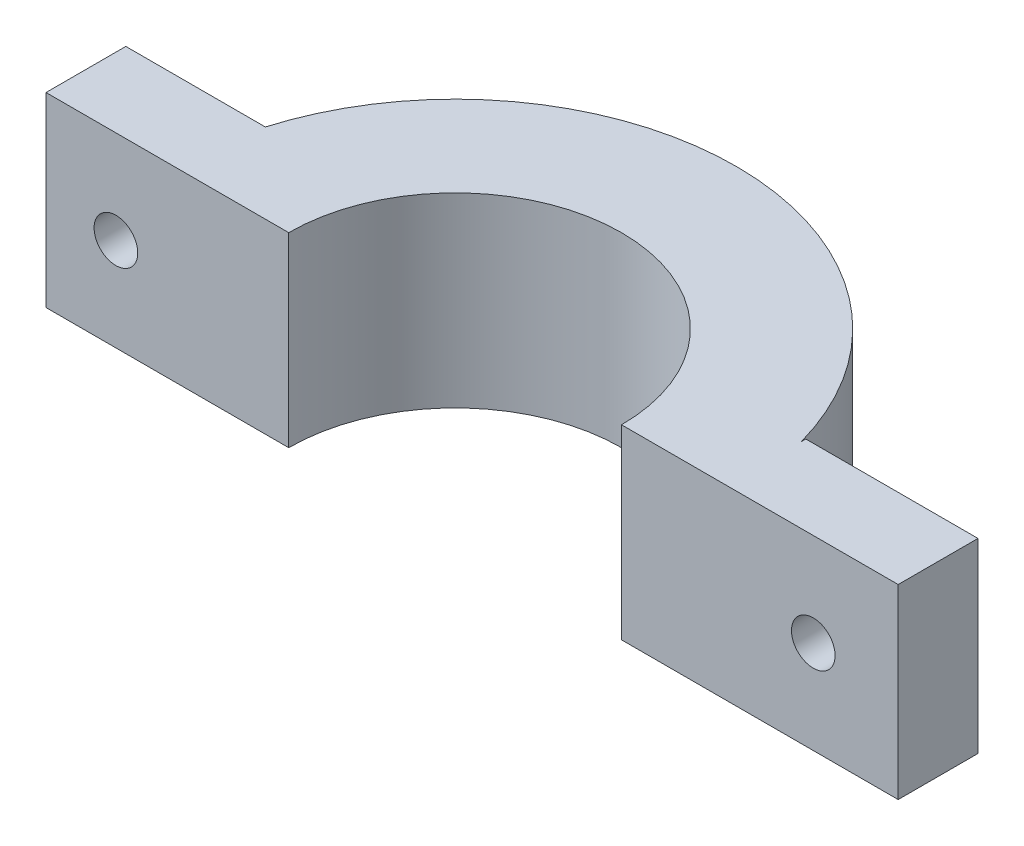
ISO-10303-21;
HEADER;
FILE_DESCRIPTION(('STEP AP214'),'2;1');
FILE_NAME('part.step','',(''),(''),'','','');
FILE_SCHEMA(('AUTOMOTIVE_DESIGN { 1 0 10303 214 1 1 1 1 }'));
ENDSEC;
DATA;
#1=APPLICATION_CONTEXT('core data for automotive mechanical design processes');
#2=APPLICATION_PROTOCOL_DEFINITION('international standard','automotive_design',2000,#1);
#3=PRODUCT_CONTEXT('',#1,'mechanical');
#4=PRODUCT('Part','Part','',(#3));
#5=PRODUCT_RELATED_PRODUCT_CATEGORY('part','',(#4));
#6=PRODUCT_DEFINITION_FORMATION('','',#4);
#7=PRODUCT_DEFINITION_CONTEXT('part definition',#1,'design');
#8=PRODUCT_DEFINITION('design','',#6,#7);
#9=PRODUCT_DEFINITION_SHAPE('','',#8);
#10=(LENGTH_UNIT() NAMED_UNIT(*) SI_UNIT(.MILLI.,.METRE.));
#11=(NAMED_UNIT(*) PLANE_ANGLE_UNIT() SI_UNIT($,.RADIAN.));
#12=(NAMED_UNIT(*) SI_UNIT($,.STERADIAN.) SOLID_ANGLE_UNIT());
#13=UNCERTAINTY_MEASURE_WITH_UNIT(LENGTH_MEASURE(1.E-05),#10,'distance_accuracy_value','');
#14=(GEOMETRIC_REPRESENTATION_CONTEXT(3) GLOBAL_UNCERTAINTY_ASSIGNED_CONTEXT((#13)) GLOBAL_UNIT_ASSIGNED_CONTEXT((#10,
#11,#12)) REPRESENTATION_CONTEXT('',''));
#15=CARTESIAN_POINT('',(0.,0.,0.));
#16=DIRECTION('',(0.,0.,1.));
#17=DIRECTION('',(1.,0.,0.));
#18=AXIS2_PLACEMENT_3D('',#15,#16,#17);
#19=CARTESIAN_POINT('',(-27.351479578733,-58.59,0.));
#20=DIRECTION('',(0.,-1.,0.));
#21=DIRECTION('',(0.,0.,-1.));
#22=AXIS2_PLACEMENT_3D('',#19,#20,#21);
#23=CYLINDRICAL_SURFACE('',#22,24.5);
#24=DIRECTION('',(0.,-1.,0.));
#25=VECTOR('',#24,1.);
#26=CARTESIAN_POINT('',(-50.8435628196889,-58.59,-6.95500000000001));
#27=LINE('',#26,#25);
#28=CARTESIAN_POINT('',(-50.8435628196889,-58.59,-6.95500000000001));
#29=VERTEX_POINT('',#28);
#30=CARTESIAN_POINT('',(-50.8435628196889,-74.82,-6.95500000000001));
#31=VERTEX_POINT('',#30);
#32=EDGE_CURVE('E170',#29,#31,#27,.T.);
#33=ORIENTED_EDGE('',*,*,#32,.F.);
#34=CARTESIAN_POINT('',(-27.351479578733,-58.59,0.));
#35=DIRECTION('',(0.,-1.,0.));
#36=DIRECTION('',(1.,0.,0.));
#37=AXIS2_PLACEMENT_3D('',#34,#35,#36);
#38=CIRCLE('',#37,24.5);
#39=CARTESIAN_POINT('',(-3.74499999999999,-58.59,-6.55622771865516));
#40=VERTEX_POINT('',#39);
#41=EDGE_CURVE('E214',#29,#40,#38,.T.);
#42=ORIENTED_EDGE('',*,*,#41,.T.);
#43=DIRECTION('',(0.,-1.,0.));
#44=VECTOR('',#43,1.);
#45=CARTESIAN_POINT('',(-3.745,-58.59,-6.55622771865516));
#46=LINE('',#45,#44);
#47=CARTESIAN_POINT('',(-3.74499999999999,-74.82,-6.55622771865516));
#48=VERTEX_POINT('',#47);
#49=EDGE_CURVE('E209',#48,#40,#46,.F.);
#50=ORIENTED_EDGE('',*,*,#49,.F.);
#51=CARTESIAN_POINT('',(-27.351479578733,-74.82,0.));
#52=DIRECTION('',(0.,-1.,0.));
#53=DIRECTION('',(1.,0.,0.));
#54=AXIS2_PLACEMENT_3D('',#51,#52,#53);
#55=CIRCLE('',#54,24.5);
#56=EDGE_CURVE('E174',#31,#48,#55,.T.);
#57=ORIENTED_EDGE('',*,*,#56,.F.);
#58=EDGE_LOOP('',(#33,#42,#50,#57));
#59=FACE_BOUND('',#58,.T.);
#60=ADVANCED_FACE('F65',(#59),#23,.T.);
#61=CARTESIAN_POINT('',(0.,-74.82,0.));
#62=DIRECTION('',(0.,-1.,0.));
#63=DIRECTION('',(0.,0.,-1.));
#64=AXIS2_PLACEMENT_3D('',#61,#62,#63);
#65=PLANE('',#64);
#66=DIRECTION('',(0.,0.,1.));
#67=VECTOR('',#66,1.);
#68=CARTESIAN_POINT('',(11.255,-74.82,-27.));
#69=LINE('',#68,#67);
#70=CARTESIAN_POINT('',(11.255,-74.82,-6.955));
#71=VERTEX_POINT('',#70);
#72=CARTESIAN_POINT('',(11.255,-74.82,0.));
#73=VERTEX_POINT('',#72);
#74=EDGE_CURVE('E69',#71,#73,#69,.T.);
#75=ORIENTED_EDGE('',*,*,#74,.T.);
#76=DIRECTION('',(-1.,0.,0.));
#77=VECTOR('',#76,1.);
#78=CARTESIAN_POINT('',(-63.,-74.82,0.));
#79=LINE('',#78,#77);
#80=CARTESIAN_POINT('',(-12.851479578733,-74.82,0.));
#81=VERTEX_POINT('',#80);
#82=EDGE_CURVE('E192',#73,#81,#79,.T.);
#83=ORIENTED_EDGE('',*,*,#82,.T.);
#84=CARTESIAN_POINT('',(-27.351479578733,-74.82,0.));
#85=DIRECTION('',(0.,-1.,0.));
#86=DIRECTION('',(0.,0.,-1.));
#87=AXIS2_PLACEMENT_3D('',#84,#85,#86);
#88=CIRCLE('',#87,14.5);
#89=CARTESIAN_POINT('',(-41.851479578733,-74.82,0.));
#90=VERTEX_POINT('',#89);
#91=EDGE_CURVE('E151',#90,#81,#88,.T.);
#92=ORIENTED_EDGE('',*,*,#91,.F.);
#93=CARTESIAN_POINT('',(-63.,-74.82,0.));
#94=VERTEX_POINT('',#93);
#95=EDGE_CURVE('E177',#90,#94,#79,.T.);
#96=ORIENTED_EDGE('',*,*,#95,.T.);
#97=DIRECTION('',(0.,0.,-1.));
#98=VECTOR('',#97,1.);
#99=CARTESIAN_POINT('',(-63.,-74.82,-6.95500000000001));
#100=LINE('',#99,#98);
#101=CARTESIAN_POINT('',(-63.,-74.82,-6.95500000000001));
#102=VERTEX_POINT('',#101);
#103=EDGE_CURVE('E175',#94,#102,#100,.T.);
#104=ORIENTED_EDGE('',*,*,#103,.T.);
#105=DIRECTION('',(1.,0.,0.));
#106=VECTOR('',#105,1.);
#107=CARTESIAN_POINT('',(-63.,-74.82,-6.95500000000001));
#108=LINE('',#107,#106);
#109=EDGE_CURVE('E171',#102,#31,#108,.T.);
#110=ORIENTED_EDGE('',*,*,#109,.T.);
#111=ORIENTED_EDGE('',*,*,#56,.T.);
#112=DIRECTION('',(0.,0.,1.));
#113=VECTOR('',#112,1.);
#114=CARTESIAN_POINT('',(-3.74499999999999,-74.82,-6.95500000000001));
#115=LINE('',#114,#113);
#116=CARTESIAN_POINT('',(-3.74499999999999,-74.82,-6.95500000000001));
#117=VERTEX_POINT('',#116);
#118=EDGE_CURVE('E205',#117,#48,#115,.T.);
#119=ORIENTED_EDGE('',*,*,#118,.F.);
#120=DIRECTION('',(1.,0.,0.));
#121=VECTOR('',#120,1.);
#122=CARTESIAN_POINT('',(11.255,-74.82,-6.955));
#123=LINE('',#122,#121);
#124=EDGE_CURVE('E197',#117,#71,#123,.T.);
#125=ORIENTED_EDGE('',*,*,#124,.T.);
#126=EDGE_LOOP('',(#75,#83,#92,#96,#104,#110,#111,#119,#125));
#127=FACE_BOUND('',#126,.T.);
#128=ADVANCED_FACE('F221',(#127),#65,.T.);
#129=CARTESIAN_POINT('',(11.255,-74.82,-6.955));
#130=DIRECTION('',(0.,0.,1.));
#131=DIRECTION('',(1.,0.,0.));
#132=AXIS2_PLACEMENT_3D('',#129,#130,#131);
#133=PLANE('',#132);
#134=CARTESIAN_POINT('',(3.85671364878704,-66.705,-6.955));
#135=DIRECTION('',(0.,0.,-1.));
#136=DIRECTION('',(-1.,0.,0.));
#137=AXIS2_PLACEMENT_3D('',#134,#135,#136);
#138=CIRCLE('',#137,1.9);
#139=CARTESIAN_POINT('',(1.95671364878704,-66.705,-6.955));
#140=VERTEX_POINT('',#139);
#141=EDGE_CURVE('E163',#140,#140,#138,.T.);
#142=ORIENTED_EDGE('',*,*,#141,.F.);
#143=EDGE_LOOP('',(#142));
#144=FACE_BOUND('',#143,.T.);
#145=DIRECTION('',(1.,0.,0.));
#146=VECTOR('',#145,1.);
#147=CARTESIAN_POINT('',(-3.74499999999999,-58.59,-6.95500000000001));
#148=LINE('',#147,#146);
#149=CARTESIAN_POINT('',(-3.74499999999999,-58.59,-6.95500000000001));
#150=VERTEX_POINT('',#149);
#151=CARTESIAN_POINT('',(11.255,-58.59,-6.955));
#152=VERTEX_POINT('',#151);
#153=EDGE_CURVE('E193',#150,#152,#148,.T.);
#154=ORIENTED_EDGE('',*,*,#153,.T.);
#155=DIRECTION('',(0.,-1.,0.));
#156=VECTOR('',#155,1.);
#157=CARTESIAN_POINT('',(11.255,-74.82,-6.955));
#158=LINE('',#157,#156);
#159=EDGE_CURVE('E84',#152,#71,#158,.T.);
#160=ORIENTED_EDGE('',*,*,#159,.T.);
#161=ORIENTED_EDGE('',*,*,#124,.F.);
#162=DIRECTION('',(0.,-1.,0.));
#163=VECTOR('',#162,1.);
#164=CARTESIAN_POINT('',(-3.74499999999999,-74.82,-6.95500000000001));
#165=LINE('',#164,#163);
#166=EDGE_CURVE('E208',#150,#117,#165,.T.);
#167=ORIENTED_EDGE('',*,*,#166,.F.);
#168=EDGE_LOOP('',(#154,#160,#161,#167));
#169=FACE_BOUND('',#168,.T.);
#170=ADVANCED_FACE('F222',(#144,#169),#133,.F.);
#171=CARTESIAN_POINT('',(-3.74499999999999,-58.59,-6.95500000000001));
#172=DIRECTION('',(0.,-1.,0.));
#173=DIRECTION('',(0.,0.,-1.));
#174=AXIS2_PLACEMENT_3D('',#171,#172,#173);
#175=PLANE('',#174);
#176=DIRECTION('',(0.,0.,-1.));
#177=VECTOR('',#176,1.);
#178=CARTESIAN_POINT('',(-3.74499999999999,-58.59,-6.95500000000001));
#179=LINE('',#178,#177);
#180=EDGE_CURVE('E206',#40,#150,#179,.T.);
#181=ORIENTED_EDGE('',*,*,#180,.F.);
#182=ORIENTED_EDGE('',*,*,#41,.F.);
#183=DIRECTION('',(1.,0.,0.));
#184=VECTOR('',#183,1.);
#185=CARTESIAN_POINT('',(-63.,-58.59,-6.95500000000001));
#186=LINE('',#185,#184);
#187=CARTESIAN_POINT('',(-63.,-58.59,-6.95500000000001));
#188=VERTEX_POINT('',#187);
#189=EDGE_CURVE('E166',#188,#29,#186,.T.);
#190=ORIENTED_EDGE('',*,*,#189,.F.);
#191=DIRECTION('',(0.,0.,1.));
#192=VECTOR('',#191,1.);
#193=CARTESIAN_POINT('',(-63.,-58.59,-6.95500000000001));
#194=LINE('',#193,#192);
#195=CARTESIAN_POINT('',(-63.,-58.59,0.));
#196=VERTEX_POINT('',#195);
#197=EDGE_CURVE('E159',#188,#196,#194,.T.);
#198=ORIENTED_EDGE('',*,*,#197,.T.);
#199=DIRECTION('',(1.,0.,0.));
#200=VECTOR('',#199,1.);
#201=CARTESIAN_POINT('',(-3.74499999999999,-58.59,0.));
#202=LINE('',#201,#200);
#203=CARTESIAN_POINT('',(-41.851479578733,-58.59,0.));
#204=VERTEX_POINT('',#203);
#205=EDGE_CURVE('E145',#196,#204,#202,.T.);
#206=ORIENTED_EDGE('',*,*,#205,.T.);
#207=CARTESIAN_POINT('',(-27.351479578733,-58.59,0.));
#208=DIRECTION('',(0.,-1.,0.));
#209=DIRECTION('',(0.,0.,-1.));
#210=AXIS2_PLACEMENT_3D('',#207,#208,#209);
#211=CIRCLE('',#210,14.5);
#212=CARTESIAN_POINT('',(-12.851479578733,-58.59,0.));
#213=VERTEX_POINT('',#212);
#214=EDGE_CURVE('E143',#204,#213,#211,.T.);
#215=ORIENTED_EDGE('',*,*,#214,.T.);
#216=CARTESIAN_POINT('',(11.255,-58.59,0.));
#217=VERTEX_POINT('',#216);
#218=EDGE_CURVE('E133',#213,#217,#202,.T.);
#219=ORIENTED_EDGE('',*,*,#218,.T.);
#220=DIRECTION('',(0.,0.,-1.));
#221=VECTOR('',#220,1.);
#222=CARTESIAN_POINT('',(11.255,-58.59,-6.955));
#223=LINE('',#222,#221);
#224=EDGE_CURVE('E142',#217,#152,#223,.T.);
#225=ORIENTED_EDGE('',*,*,#224,.T.);
#226=ORIENTED_EDGE('',*,*,#153,.F.);
#227=EDGE_LOOP('',(#181,#182,#190,#198,#206,#215,#219,#225,#226));
#228=FACE_BOUND('',#227,.T.);
#229=ADVANCED_FACE('F155',(#228),#175,.F.);
#230=CARTESIAN_POINT('',(-3.745,0.,0.));
#231=DIRECTION('',(1.,0.,0.));
#232=DIRECTION('',(0.,0.,-1.));
#233=AXIS2_PLACEMENT_3D('',#230,#231,#232);
#234=PLANE('',#233);
#235=ORIENTED_EDGE('',*,*,#118,.T.);
#236=ORIENTED_EDGE('',*,*,#49,.T.);
#237=ORIENTED_EDGE('',*,*,#180,.T.);
#238=ORIENTED_EDGE('',*,*,#166,.T.);
#239=EDGE_LOOP('',(#235,#236,#237,#238));
#240=FACE_BOUND('',#239,.T.);
#241=ADVANCED_FACE('F225',(#240),#234,.F.);
#242=CARTESIAN_POINT('',(-27.351479578733,-58.59,0.));
#243=DIRECTION('',(0.,-1.,0.));
#244=DIRECTION('',(0.,0.,-1.));
#245=AXIS2_PLACEMENT_3D('',#242,#243,#244);
#246=CYLINDRICAL_SURFACE('',#245,14.5);
#247=ORIENTED_EDGE('',*,*,#91,.T.);
#248=DIRECTION('',(0.,-1.,0.));
#249=VECTOR('',#248,1.);
#250=CARTESIAN_POINT('',(-12.851479578733,-58.59,0.));
#251=LINE('',#250,#249);
#252=EDGE_CURVE('E137',#81,#213,#251,.F.);
#253=ORIENTED_EDGE('',*,*,#252,.T.);
#254=ORIENTED_EDGE('',*,*,#214,.F.);
#255=DIRECTION('',(0.,-1.,0.));
#256=VECTOR('',#255,1.);
#257=CARTESIAN_POINT('',(-41.851479578733,-58.59,0.));
#258=LINE('',#257,#256);
#259=EDGE_CURVE('E152',#204,#90,#258,.T.);
#260=ORIENTED_EDGE('',*,*,#259,.T.);
#261=EDGE_LOOP('',(#247,#253,#254,#260));
#262=FACE_BOUND('',#261,.T.);
#263=ADVANCED_FACE('F148',(#262),#246,.F.);
#264=CARTESIAN_POINT('',(3.85671364878704,-66.705,24.5));
#265=DIRECTION('',(0.,0.,-1.));
#266=DIRECTION('',(-1.,0.,0.));
#267=AXIS2_PLACEMENT_3D('',#264,#265,#266);
#268=CYLINDRICAL_SURFACE('',#267,1.9);
#269=CARTESIAN_POINT('',(3.85671364878704,-66.705,0.));
#270=DIRECTION('',(0.,0.,-1.));
#271=DIRECTION('',(-1.,0.,0.));
#272=AXIS2_PLACEMENT_3D('',#269,#270,#271);
#273=CIRCLE('',#272,1.9);
#274=CARTESIAN_POINT('',(1.95671364878704,-66.705,0.));
#275=VERTEX_POINT('',#274);
#276=EDGE_CURVE('E167',#275,#275,#273,.F.);
#277=ORIENTED_EDGE('',*,*,#276,.T.);
#278=EDGE_LOOP('',(#277));
#279=FACE_BOUND('',#278,.T.);
#280=ORIENTED_EDGE('',*,*,#141,.T.);
#281=EDGE_LOOP('',(#280));
#282=FACE_BOUND('',#281,.T.);
#283=ADVANCED_FACE('F259',(#279,#282),#268,.F.);
#284=CARTESIAN_POINT('',(-63.,-58.59,-6.95500000000001));
#285=DIRECTION('',(0.,0.,-1.));
#286=DIRECTION('',(-1.,0.,0.));
#287=AXIS2_PLACEMENT_3D('',#284,#285,#286);
#288=PLANE('',#287);
#289=CARTESIAN_POINT('',(-56.9080400165376,-66.705,-6.95500000000001));
#290=DIRECTION('',(0.,0.,-1.));
#291=DIRECTION('',(-1.,0.,0.));
#292=AXIS2_PLACEMENT_3D('',#289,#290,#291);
#293=CIRCLE('',#292,1.9);
#294=CARTESIAN_POINT('',(-58.8080400165376,-66.705,-6.95500000000001));
#295=VERTEX_POINT('',#294);
#296=EDGE_CURVE('E75',#295,#295,#293,.T.);
#297=ORIENTED_EDGE('',*,*,#296,.F.);
#298=EDGE_LOOP('',(#297));
#299=FACE_BOUND('',#298,.T.);
#300=ORIENTED_EDGE('',*,*,#189,.T.);
#301=ORIENTED_EDGE('',*,*,#32,.T.);
#302=ORIENTED_EDGE('',*,*,#109,.F.);
#303=DIRECTION('',(0.,1.,0.));
#304=VECTOR('',#303,1.);
#305=CARTESIAN_POINT('',(-63.,-58.59,-6.95500000000001));
#306=LINE('',#305,#304);
#307=EDGE_CURVE('E179',#102,#188,#306,.T.);
#308=ORIENTED_EDGE('',*,*,#307,.T.);
#309=EDGE_LOOP('',(#300,#301,#302,#308));
#310=FACE_BOUND('',#309,.T.);
#311=ADVANCED_FACE('F245',(#299,#310),#288,.T.);
#312=CARTESIAN_POINT('',(-63.,0.,0.));
#313=DIRECTION('',(-1.,0.,0.));
#314=DIRECTION('',(0.,0.,1.));
#315=AXIS2_PLACEMENT_3D('',#312,#313,#314);
#316=PLANE('',#315);
#317=DIRECTION('',(0.,1.,0.));
#318=VECTOR('',#317,1.);
#319=CARTESIAN_POINT('',(-63.,-74.82,0.));
#320=LINE('',#319,#318);
#321=EDGE_CURVE('E182',#94,#196,#320,.T.);
#322=ORIENTED_EDGE('',*,*,#321,.T.);
#323=ORIENTED_EDGE('',*,*,#197,.F.);
#324=ORIENTED_EDGE('',*,*,#307,.F.);
#325=ORIENTED_EDGE('',*,*,#103,.F.);
#326=EDGE_LOOP('',(#322,#323,#324,#325));
#327=FACE_BOUND('',#326,.T.);
#328=ADVANCED_FACE('F243',(#327),#316,.T.);
#329=CARTESIAN_POINT('',(-56.9080400165376,-66.705,24.5));
#330=DIRECTION('',(0.,0.,-1.));
#331=DIRECTION('',(-1.,0.,0.));
#332=AXIS2_PLACEMENT_3D('',#329,#330,#331);
#333=CYLINDRICAL_SURFACE('',#332,1.9);
#334=CARTESIAN_POINT('',(-56.9080400165376,-66.705,0.));
#335=DIRECTION('',(0.,0.,-1.));
#336=DIRECTION('',(-1.,0.,0.));
#337=AXIS2_PLACEMENT_3D('',#334,#335,#336);
#338=CIRCLE('',#337,1.9);
#339=CARTESIAN_POINT('',(-58.8080400165376,-66.705,0.));
#340=VERTEX_POINT('',#339);
#341=EDGE_CURVE('E184',#340,#340,#338,.F.);
#342=ORIENTED_EDGE('',*,*,#341,.T.);
#343=EDGE_LOOP('',(#342));
#344=FACE_BOUND('',#343,.T.);
#345=ORIENTED_EDGE('',*,*,#296,.T.);
#346=EDGE_LOOP('',(#345));
#347=FACE_BOUND('',#346,.T.);
#348=ADVANCED_FACE('F232',(#344,#347),#333,.F.);
#349=CARTESIAN_POINT('',(-63.,-74.82,0.));
#350=DIRECTION('',(0.,0.,-1.));
#351=DIRECTION('',(-1.,0.,0.));
#352=AXIS2_PLACEMENT_3D('',#349,#350,#351);
#353=PLANE('',#352);
#354=ORIENTED_EDGE('',*,*,#341,.F.);
#355=EDGE_LOOP('',(#354));
#356=FACE_BOUND('',#355,.T.);
#357=ORIENTED_EDGE('',*,*,#321,.F.);
#358=ORIENTED_EDGE('',*,*,#95,.F.);
#359=ORIENTED_EDGE('',*,*,#259,.F.);
#360=ORIENTED_EDGE('',*,*,#205,.F.);
#361=EDGE_LOOP('',(#357,#358,#359,#360));
#362=FACE_BOUND('',#361,.T.);
#363=ADVANCED_FACE('F235',(#356,#362),#353,.F.);
#364=ORIENTED_EDGE('',*,*,#276,.F.);
#365=EDGE_LOOP('',(#364));
#366=FACE_BOUND('',#365,.T.);
#367=ORIENTED_EDGE('',*,*,#82,.F.);
#368=DIRECTION('',(0.,1.,0.));
#369=VECTOR('',#368,1.);
#370=CARTESIAN_POINT('',(11.255,-74.82,0.));
#371=LINE('',#370,#369);
#372=EDGE_CURVE('E12',#73,#217,#371,.T.);
#373=ORIENTED_EDGE('',*,*,#372,.T.);
#374=ORIENTED_EDGE('',*,*,#218,.F.);
#375=ORIENTED_EDGE('',*,*,#252,.F.);
#376=EDGE_LOOP('',(#367,#373,#374,#375));
#377=FACE_BOUND('',#376,.T.);
#378=ADVANCED_FACE('F136',(#366,#377),#353,.F.);
#379=CARTESIAN_POINT('',(11.255,-74.82,-27.));
#380=DIRECTION('',(-1.,0.,0.));
#381=DIRECTION('',(0.,0.,1.));
#382=AXIS2_PLACEMENT_3D('',#379,#380,#381);
#383=PLANE('',#382);
#384=ORIENTED_EDGE('',*,*,#224,.F.);
#385=ORIENTED_EDGE('',*,*,#372,.F.);
#386=ORIENTED_EDGE('',*,*,#74,.F.);
#387=ORIENTED_EDGE('',*,*,#159,.F.);
#388=EDGE_LOOP('',(#384,#385,#386,#387));
#389=FACE_BOUND('',#388,.T.);
#390=ADVANCED_FACE('F67',(#389),#383,.F.);
#391=CLOSED_SHELL('',(#60,#128,#170,#229,#241,#263,#283,#311,#328,#348,#363,#378,#390));
#392=MANIFOLD_SOLID_BREP('B2',#391);
#393=ADVANCED_BREP_SHAPE_REPRESENTATION('',(#18,#392),#14);
#394=SHAPE_DEFINITION_REPRESENTATION(#9,#393);
ENDSEC;
END-ISO-10303-21;
